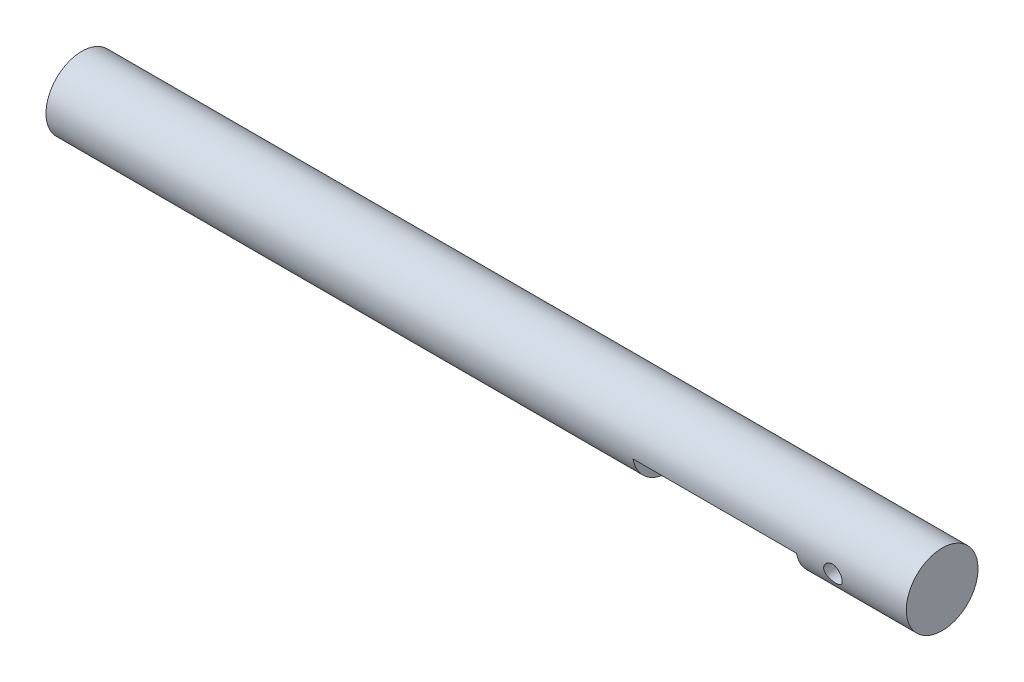
ISO-10303-21;
HEADER;
FILE_DESCRIPTION(('STEP AP214'),'2;1');
FILE_NAME('part.step','',(''),(''),'','','');
FILE_SCHEMA(('AUTOMOTIVE_DESIGN { 1 0 10303 214 1 1 1 1 }'));
ENDSEC;
DATA;
#1=APPLICATION_CONTEXT('core data for automotive mechanical design processes');
#2=APPLICATION_PROTOCOL_DEFINITION('international standard','automotive_design',2000,#1);
#3=PRODUCT_CONTEXT('',#1,'mechanical');
#4=PRODUCT('Part','Part','',(#3));
#5=PRODUCT_RELATED_PRODUCT_CATEGORY('part','',(#4));
#6=PRODUCT_DEFINITION_FORMATION('','',#4);
#7=PRODUCT_DEFINITION_CONTEXT('part definition',#1,'design');
#8=PRODUCT_DEFINITION('design','',#6,#7);
#9=PRODUCT_DEFINITION_SHAPE('','',#8);
#10=(LENGTH_UNIT() NAMED_UNIT(*) SI_UNIT(.MILLI.,.METRE.));
#11=(NAMED_UNIT(*) PLANE_ANGLE_UNIT() SI_UNIT($,.RADIAN.));
#12=(NAMED_UNIT(*) SI_UNIT($,.STERADIAN.) SOLID_ANGLE_UNIT());
#13=UNCERTAINTY_MEASURE_WITH_UNIT(LENGTH_MEASURE(1.E-05),#10,'distance_accuracy_value','');
#14=(GEOMETRIC_REPRESENTATION_CONTEXT(3) GLOBAL_UNCERTAINTY_ASSIGNED_CONTEXT((#13)) GLOBAL_UNIT_ASSIGNED_CONTEXT((#10,
#11,#12)) REPRESENTATION_CONTEXT('',''));
#15=CARTESIAN_POINT('',(0.,0.,0.));
#16=DIRECTION('',(0.,0.,1.));
#17=DIRECTION('',(1.,0.,0.));
#18=AXIS2_PLACEMENT_3D('',#15,#16,#17);
#19=CARTESIAN_POINT('',(33.5,6.25,0.));
#20=DIRECTION('',(-1.,0.,0.));
#21=DIRECTION('',(0.,0.,1.));
#22=AXIS2_PLACEMENT_3D('',#19,#20,#21);
#23=CYLINDRICAL_SURFACE('',#22,6.25);
#24=CARTESIAN_POINT('',(-116.5,6.25,0.));
#25=DIRECTION('',(-1.,0.,0.));
#26=DIRECTION('',(0.,-1.,0.));
#27=AXIS2_PLACEMENT_3D('',#24,#25,#26);
#28=CIRCLE('',#27,6.25);
#29=CARTESIAN_POINT('',(-116.5,0.,0.));
#30=VERTEX_POINT('',#29);
#31=EDGE_CURVE('E75',#30,#30,#28,.T.);
#32=ORIENTED_EDGE('',*,*,#31,.F.);
#33=EDGE_LOOP('',(#32));
#34=FACE_BOUND('',#33,.T.);
#35=CARTESIAN_POINT('',(33.5,6.25,0.));
#36=DIRECTION('',(-1.,0.,0.));
#37=DIRECTION('',(0.,-1.,0.));
#38=AXIS2_PLACEMENT_3D('',#35,#36,#37);
#39=CIRCLE('',#38,6.25);
#40=CARTESIAN_POINT('',(33.5,0.,0.));
#41=VERTEX_POINT('',#40);
#42=EDGE_CURVE('E66',#41,#41,#39,.T.);
#43=ORIENTED_EDGE('',*,*,#42,.T.);
#44=EDGE_LOOP('',(#43));
#45=FACE_BOUND('',#44,.T.);
#46=CARTESIAN_POINT('',(14.25,6.25,0.));
#47=DIRECTION('',(-1.,0.,0.));
#48=DIRECTION('',(0.,-1.,0.));
#49=AXIS2_PLACEMENT_3D('',#46,#47,#48);
#50=CIRCLE('',#49,6.25);
#51=CARTESIAN_POINT('',(14.25,5.14999999999997,-6.15243854093642));
#52=VERTEX_POINT('',#51);
#53=CARTESIAN_POINT('',(14.25,5.14999999999994,6.15243854093642));
#54=VERTEX_POINT('',#53);
#55=EDGE_CURVE('E49',#52,#54,#50,.T.);
#56=ORIENTED_EDGE('',*,*,#55,.F.);
#57=DIRECTION('',(-1.,0.,0.));
#58=VECTOR('',#57,1.);
#59=CARTESIAN_POINT('',(33.5,5.14999999999994,-6.15243854093642));
#60=LINE('',#59,#58);
#61=CARTESIAN_POINT('',(-14.25,5.15,-6.15243854093642));
#62=VERTEX_POINT('',#61);
#63=EDGE_CURVE('E11',#62,#52,#60,.F.);
#64=ORIENTED_EDGE('',*,*,#63,.F.);
#65=CARTESIAN_POINT('',(-14.25,6.25,0.));
#66=DIRECTION('',(-1.,0.,0.));
#67=DIRECTION('',(0.,0.,1.));
#68=AXIS2_PLACEMENT_3D('',#65,#66,#67);
#69=CIRCLE('',#68,6.25);
#70=CARTESIAN_POINT('',(-14.25,5.15,6.15243854093642));
#71=VERTEX_POINT('',#70);
#72=EDGE_CURVE('E56',#62,#71,#69,.T.);
#73=ORIENTED_EDGE('',*,*,#72,.T.);
#74=DIRECTION('',(-1.,0.,0.));
#75=VECTOR('',#74,1.);
#76=CARTESIAN_POINT('',(33.5,5.14999999999994,6.15243854093642));
#77=LINE('',#76,#75);
#78=EDGE_CURVE('E43',#54,#71,#77,.T.);
#79=ORIENTED_EDGE('',*,*,#78,.F.);
#80=EDGE_LOOP('',(#56,#64,#73,#79));
#81=FACE_BOUND('',#80,.T.);
#82=CARTESIAN_POINT('',(19.0125,5.15,6.15243854093643));
#83=CARTESIAN_POINT('',(19.0125034400561,5.05894949307662,6.13615705257174));
#84=CARTESIAN_POINT('',(19.0203601154514,4.9682213588185,6.11783029645399));
#85=CARTESIAN_POINT('',(19.0511888044404,4.79009711635156,6.07779115017929));
#86=CARTESIAN_POINT('',(19.0741766136601,4.70270459121124,6.05607524012436));
#87=CARTESIAN_POINT('',(19.1342386068315,4.53378915505121,6.0103876617501));
#88=CARTESIAN_POINT('',(19.1712801490714,4.45225315944522,5.98642131671098));
#89=CARTESIAN_POINT('',(19.2583276946763,4.2967625399177,5.93750910818044));
#90=CARTESIAN_POINT('',(19.3083340085916,4.22280809765933,5.91256322123781));
#91=CARTESIAN_POINT('',(19.4220288356238,4.08181562838189,5.86236032008227));
#92=CARTESIAN_POINT('',(19.4861260121833,4.01509973526759,5.83712173737863));
#93=CARTESIAN_POINT('',(19.6254676733933,3.89341870182155,5.78906839779039));
#94=CARTESIAN_POINT('',(19.7007129875245,3.83845443661772,5.76625382148188));
#95=CARTESIAN_POINT('',(19.8594414638567,3.7428080921375,5.72530925588944));
#96=CARTESIAN_POINT('',(19.9427920156136,3.70193372441335,5.70711716671715));
#97=CARTESIAN_POINT('',(20.116305029815,3.63513437033712,5.67682477613882));
#98=CARTESIAN_POINT('',(20.2064619394486,3.60919734363187,5.66471956935823));
#99=CARTESIAN_POINT('',(20.38280527059,3.57508562405573,5.64868641974786));
#100=CARTESIAN_POINT('',(20.4686823865482,3.56559394262753,5.64415335111095));
#101=CARTESIAN_POINT('',(20.6409159077228,3.56069332040718,5.64182075028513));
#102=CARTESIAN_POINT('',(20.7272721291581,3.56527930826678,5.64401879327574));
#103=CARTESIAN_POINT('',(20.8924984016978,3.58758806425763,5.65457291716716));
#104=CARTESIAN_POINT('',(20.9715051391808,3.60449861803912,5.66254808487443));
#105=CARTESIAN_POINT('',(21.125434540663,3.64982835099032,5.68350472928734));
#106=CARTESIAN_POINT('',(21.2003565623908,3.67824933414588,5.69648699072054));
#107=CARTESIAN_POINT('',(21.3470019920881,3.74681447080504,5.72695486548573));
#108=CARTESIAN_POINT('',(21.4185160017484,3.78734060206403,5.74458458570154));
#109=CARTESIAN_POINT('',(21.553936410097,3.87845411887118,5.78279409801211));
#110=CARTESIAN_POINT('',(21.6178399467961,3.9290452704841,5.80337499355138));
#111=CARTESIAN_POINT('',(21.7421146847953,4.04388125626948,5.8480468529554));
#112=CARTESIAN_POINT('',(21.8016870706405,4.10893360392103,5.87228737234194));
#113=CARTESIAN_POINT('',(21.9092414595319,4.24790842013142,5.92111086505682));
#114=CARTESIAN_POINT('',(21.9572194043146,4.32183398096361,5.94569395511597));
#115=CARTESIAN_POINT('',(22.0425598966332,4.48087489658101,5.99499507301222));
#116=CARTESIAN_POINT('',(22.0792525177699,4.56636952801247,6.01965546731216));
#117=CARTESIAN_POINT('',(22.1372856824014,4.74311429916242,6.06631187311527));
#118=CARTESIAN_POINT('',(22.1586284056375,4.83436361969164,6.08830826254778));
#119=CARTESIAN_POINT('',(22.1846452793123,5.01790856419232,6.12805544362383));
#120=CARTESIAN_POINT('',(22.1896879288205,5.11013304647882,6.14589150739708));
#121=CARTESIAN_POINT('',(22.1835785232579,5.29477181348628,6.17728082605186));
#122=CARTESIAN_POINT('',(22.1724318806882,5.38718602446242,6.19083551046544));
#123=CARTESIAN_POINT('',(22.1349537335178,5.56458159040548,6.21291377369791));
#124=CARTESIAN_POINT('',(22.1094117626261,5.64970328166666,6.2216555673564));
#125=CARTESIAN_POINT('',(22.0443465663328,5.8147436835075,6.23537577702151));
#126=CARTESIAN_POINT('',(22.0048247862676,5.89466293094343,6.24035458190698));
#127=CARTESIAN_POINT('',(21.913823965725,6.04533005356452,6.2470948764738));
#128=CARTESIAN_POINT('',(21.862599261575,6.11622911573901,6.24891858322368));
#129=CARTESIAN_POINT('',(21.7492024727391,6.24867703090497,6.25035138169719));
#130=CARTESIAN_POINT('',(21.6870297405127,6.31022533042765,6.24996034238308));
#131=CARTESIAN_POINT('',(21.5526620772477,6.42293790613247,6.24786489018451));
#132=CARTESIAN_POINT('',(21.4803582249902,6.47397202601017,6.24614513812272));
#133=CARTESIAN_POINT('',(21.3282938894633,6.56333748786835,6.24230146237706));
#134=CARTESIAN_POINT('',(21.2485329895371,6.60166811950682,6.24017751610226));
#135=CARTESIAN_POINT('',(21.0827867460405,6.66493628296196,6.23629305803389));
#136=CARTESIAN_POINT('',(20.9967398389418,6.68971299452197,6.23453705662098));
#137=CARTESIAN_POINT('',(20.8216950815527,6.72447441941379,6.23198857753266));
#138=CARTESIAN_POINT('',(20.7326972761519,6.73445935765547,6.23119608520707));
#139=CARTESIAN_POINT('',(20.5543972841055,6.73934585853901,6.2308143224154));
#140=CARTESIAN_POINT('',(20.4650956176995,6.73426627991663,6.23122354755544));
#141=CARTESIAN_POINT('',(20.2886185424207,6.70921172209549,6.23311956685318));
#142=CARTESIAN_POINT('',(20.2014431672328,6.68923650707734,6.23460637807061));
#143=CARTESIAN_POINT('',(20.0317452652288,6.63498246583709,6.23819054535774));
#144=CARTESIAN_POINT('',(19.9492195548511,6.60071356478367,6.24028747747019));
#145=CARTESIAN_POINT('',(19.7910677824419,6.51883674374733,6.24434937845433));
#146=CARTESIAN_POINT('',(19.7154418768612,6.47122852139904,6.24631434433345));
#147=CARTESIAN_POINT('',(19.5730329931037,6.36386452001311,6.24919335357978));
#148=CARTESIAN_POINT('',(19.5062733604404,6.30407768190603,6.25010466934269));
#149=CARTESIAN_POINT('',(19.383739997277,6.17412954246134,6.24987633368118));
#150=CARTESIAN_POINT('',(19.3279667974562,6.10396774026668,6.24873658321075));
#151=CARTESIAN_POINT('',(19.229457740369,5.95598125606282,6.24351523976515));
#152=CARTESIAN_POINT('',(19.1866152373632,5.87822667367627,6.23945870000341));
#153=CARTESIAN_POINT('',(19.1145625865425,5.71693934167787,6.22774930761431));
#154=CARTESIAN_POINT('',(19.0853415755914,5.63341125769234,6.22009933056189));
#155=CARTESIAN_POINT('',(19.0463589532224,5.48303145748763,6.20311116946818));
#156=CARTESIAN_POINT('',(19.0336482148878,5.41683439961674,6.19458296778898));
#157=CARTESIAN_POINT('',(19.0167173896474,5.2837004614607,6.17521594787551));
#158=CARTESIAN_POINT('',(19.0124974775493,5.21676356597241,6.1643770820747));
#159=CARTESIAN_POINT('',(19.0125,5.15,6.15243854093643));
#160=B_SPLINE_CURVE_WITH_KNOTS('',3,(#82,#83,#84,#85,#86,#87,#88,#89,#90,#91,#92,#93,#94,#95,
#96,#97,#98,#99,#100,#101,#102,#103,#104,#105,#106,#107,#108,#109,#110,#111,#112,#113,#114,#115,
#116,#117,#118,#119,#120,#121,#122,#123,#124,#125,#126,#127,#128,#129,#130,#131,#132,#133,#134,
#135,#136,#137,#138,#139,#140,#141,#142,#143,#144,#145,#146,#147,#148,#149,#150,#151,#152,#153,
#154,#155,#156,#157,#158,#159),.UNSPECIFIED.,.T.,.F.,(4,2,2,2,2,2,2,2,2,2,2,2,2,2,2,2,2,2,2,2,2,
2,2,2,2,2,2,2,2,2,2,2,2,2,2,2,2,2,4),(0.,0.277225349261248,0.554740558331614,0.831615107707004,
1.10849628978152,1.39482581379738,1.6811766529666,1.96344860324396,2.24549270654046,
2.50367734302081,2.76176898182502,3.00423376216557,3.24673655780443,3.49788876975718,
3.74913513357871,4.02237365718313,4.29570768112714,4.58304779001523,4.87034708750057,
5.15110419029711,5.43176745030251,5.69835581242251,5.96491662071158,6.22615837463258,
6.48741558535419,6.75173476095854,7.0160687140276,7.28347453975165,7.55087629951132,
7.81794344982796,8.08501482829218,8.35190106715985,8.61879335608711,8.88637501809365,
9.15396960197107,9.41929277618297,9.68440399169708,9.8876776744081,10.0909555420448),.UNSPECIFIED.);
#161=CARTESIAN_POINT('',(19.0125,5.15,6.15243854093643));
#162=VERTEX_POINT('',#161);
#163=EDGE_CURVE('E203',#162,#162,#160,.T.);
#164=ORIENTED_EDGE('',*,*,#163,.F.);
#165=EDGE_LOOP('',(#164));
#166=FACE_BOUND('',#165,.T.);
#167=ADVANCED_FACE('F36',(#34,#45,#81,#166),#23,.T.);
#168=CARTESIAN_POINT('',(33.5,6.25,0.));
#169=DIRECTION('',(-1.,0.,0.));
#170=DIRECTION('',(0.,-1.,0.));
#171=AXIS2_PLACEMENT_3D('',#168,#169,#170);
#172=PLANE('',#171);
#173=ORIENTED_EDGE('',*,*,#42,.F.);
#174=EDGE_LOOP('',(#173));
#175=FACE_BOUND('',#174,.T.);
#176=ADVANCED_FACE('F101',(#175),#172,.F.);
#177=CARTESIAN_POINT('',(-116.5,6.25,0.));
#178=DIRECTION('',(-1.,0.,0.));
#179=DIRECTION('',(0.,-1.,0.));
#180=AXIS2_PLACEMENT_3D('',#177,#178,#179);
#181=PLANE('',#180);
#182=ORIENTED_EDGE('',*,*,#31,.T.);
#183=EDGE_LOOP('',(#182));
#184=FACE_BOUND('',#183,.T.);
#185=ADVANCED_FACE('F98',(#184),#181,.T.);
#186=CARTESIAN_POINT('',(14.25,5.14999999999997,-6.25));
#187=DIRECTION('',(1.,0.,0.));
#188=DIRECTION('',(0.,1.,0.));
#189=AXIS2_PLACEMENT_3D('',#186,#187,#188);
#190=PLANE('',#189);
#191=DIRECTION('',(0.,0.,1.));
#192=VECTOR('',#191,1.);
#193=CARTESIAN_POINT('',(14.25,5.14999999999997,-6.25));
#194=LINE('',#193,#192);
#195=EDGE_CURVE('E70',#52,#54,#194,.T.);
#196=ORIENTED_EDGE('',*,*,#195,.F.);
#197=ORIENTED_EDGE('',*,*,#55,.T.);
#198=EDGE_LOOP('',(#196,#197));
#199=FACE_BOUND('',#198,.T.);
#200=ADVANCED_FACE('F72',(#199),#190,.F.);
#201=CARTESIAN_POINT('',(-14.25,5.15,-6.25));
#202=DIRECTION('',(-1.,0.,0.));
#203=DIRECTION('',(0.,-1.,0.));
#204=AXIS2_PLACEMENT_3D('',#201,#202,#203);
#205=PLANE('',#204);
#206=DIRECTION('',(0.,0.,-1.));
#207=VECTOR('',#206,1.);
#208=CARTESIAN_POINT('',(-14.25,5.15,-6.25));
#209=LINE('',#208,#207);
#210=EDGE_CURVE('E71',#71,#62,#209,.T.);
#211=ORIENTED_EDGE('',*,*,#210,.F.);
#212=ORIENTED_EDGE('',*,*,#72,.F.);
#213=EDGE_LOOP('',(#211,#212));
#214=FACE_BOUND('',#213,.T.);
#215=ADVANCED_FACE('F88',(#214),#205,.F.);
#216=CARTESIAN_POINT('',(0.,5.14999999999998,0.));
#217=DIRECTION('',(0.,1.,0.));
#218=DIRECTION('',(-1.,0.,0.));
#219=AXIS2_PLACEMENT_3D('',#216,#217,#218);
#220=PLANE('',#219);
#221=CARTESIAN_POINT('',(-7.49999999999999,5.14999999999999,0.));
#222=DIRECTION('',(0.,-1.,0.));
#223=DIRECTION('',(1.,0.,0.));
#224=AXIS2_PLACEMENT_3D('',#221,#222,#223);
#225=CIRCLE('',#224,1.25);
#226=CARTESIAN_POINT('',(-6.25,5.14999999999999,0.));
#227=VERTEX_POINT('',#226);
#228=EDGE_CURVE('E78',#227,#227,#225,.T.);
#229=ORIENTED_EDGE('',*,*,#228,.F.);
#230=EDGE_LOOP('',(#229));
#231=FACE_BOUND('',#230,.T.);
#232=CARTESIAN_POINT('',(7.50000000000001,5.14999999999997,0.));
#233=DIRECTION('',(0.,-1.,0.));
#234=DIRECTION('',(1.,0.,0.));
#235=AXIS2_PLACEMENT_3D('',#232,#233,#234);
#236=CIRCLE('',#235,1.25);
#237=CARTESIAN_POINT('',(8.75,5.14999999999997,0.));
#238=VERTEX_POINT('',#237);
#239=EDGE_CURVE('E81',#238,#238,#236,.T.);
#240=ORIENTED_EDGE('',*,*,#239,.F.);
#241=EDGE_LOOP('',(#240));
#242=FACE_BOUND('',#241,.T.);
#243=ORIENTED_EDGE('',*,*,#63,.T.);
#244=ORIENTED_EDGE('',*,*,#195,.T.);
#245=ORIENTED_EDGE('',*,*,#78,.T.);
#246=ORIENTED_EDGE('',*,*,#210,.T.);
#247=EDGE_LOOP('',(#243,#244,#245,#246));
#248=FACE_BOUND('',#247,.T.);
#249=ADVANCED_FACE('F69',(#231,#242,#248),#220,.F.);
#250=CARTESIAN_POINT('',(7.50000000000001,8.32499999999997,0.));
#251=DIRECTION('',(0.,-1.,0.));
#252=DIRECTION('',(1.,0.,0.));
#253=AXIS2_PLACEMENT_3D('',#250,#251,#252);
#254=CYLINDRICAL_SURFACE('',#253,1.25);
#255=CARTESIAN_POINT('',(7.50000000000001,8.32499999999997,0.));
#256=DIRECTION('',(0.,-1.,0.));
#257=DIRECTION('',(1.,0.,0.));
#258=AXIS2_PLACEMENT_3D('',#255,#256,#257);
#259=CIRCLE('',#258,1.25);
#260=CARTESIAN_POINT('',(8.75000000000001,8.32499999999997,0.));
#261=VERTEX_POINT('',#260);
#262=EDGE_CURVE('E212',#261,#261,#259,.T.);
#263=ORIENTED_EDGE('',*,*,#262,.F.);
#264=EDGE_LOOP('',(#263));
#265=FACE_BOUND('',#264,.T.);
#266=ORIENTED_EDGE('',*,*,#239,.T.);
#267=EDGE_LOOP('',(#266));
#268=FACE_BOUND('',#267,.T.);
#269=ADVANCED_FACE('F95',(#265,#268),#254,.F.);
#270=CARTESIAN_POINT('',(7.50000000000001,8.32499999999997,0.));
#271=DIRECTION('',(0.,-1.,0.));
#272=DIRECTION('',(1.,0.,0.));
#273=AXIS2_PLACEMENT_3D('',#270,#271,#272);
#274=PLANE('',#273);
#275=ORIENTED_EDGE('',*,*,#262,.T.);
#276=EDGE_LOOP('',(#275));
#277=FACE_BOUND('',#276,.T.);
#278=ADVANCED_FACE('F140',(#277),#274,.T.);
#279=CARTESIAN_POINT('',(-7.49999999999999,8.32499999999999,0.));
#280=DIRECTION('',(0.,-1.,0.));
#281=DIRECTION('',(1.,0.,0.));
#282=AXIS2_PLACEMENT_3D('',#279,#280,#281);
#283=CYLINDRICAL_SURFACE('',#282,1.25);
#284=CARTESIAN_POINT('',(-7.49999999999999,8.32499999999999,0.));
#285=DIRECTION('',(0.,-1.,0.));
#286=DIRECTION('',(1.,0.,0.));
#287=AXIS2_PLACEMENT_3D('',#284,#285,#286);
#288=CIRCLE('',#287,1.25);
#289=CARTESIAN_POINT('',(-6.24999999999999,8.32499999999999,0.));
#290=VERTEX_POINT('',#289);
#291=EDGE_CURVE('E73',#290,#290,#288,.T.);
#292=ORIENTED_EDGE('',*,*,#291,.F.);
#293=EDGE_LOOP('',(#292));
#294=FACE_BOUND('',#293,.T.);
#295=ORIENTED_EDGE('',*,*,#228,.T.);
#296=EDGE_LOOP('',(#295));
#297=FACE_BOUND('',#296,.T.);
#298=ADVANCED_FACE('F150',(#294,#297),#283,.F.);
#299=CARTESIAN_POINT('',(-7.49999999999999,8.32499999999999,0.));
#300=DIRECTION('',(0.,-1.,0.));
#301=DIRECTION('',(1.,0.,0.));
#302=AXIS2_PLACEMENT_3D('',#299,#300,#301);
#303=PLANE('',#302);
#304=ORIENTED_EDGE('',*,*,#291,.T.);
#305=EDGE_LOOP('',(#304));
#306=FACE_BOUND('',#305,.T.);
#307=ADVANCED_FACE('F160',(#306),#303,.T.);
#308=CARTESIAN_POINT('',(20.6,5.15,6.251));
#309=DIRECTION('',(0.,0.,-1.));
#310=DIRECTION('',(-1.,0.,0.));
#311=AXIS2_PLACEMENT_3D('',#308,#309,#310);
#312=CYLINDRICAL_SURFACE('',#311,1.5875);
#313=CARTESIAN_POINT('',(20.6,5.15,0.));
#314=DIRECTION('',(0.,0.,1.));
#315=DIRECTION('',(1.,0.,0.));
#316=AXIS2_PLACEMENT_3D('',#313,#314,#315);
#317=CIRCLE('',#316,1.5875);
#318=CARTESIAN_POINT('',(22.1875,5.15,0.));
#319=VERTEX_POINT('',#318);
#320=EDGE_CURVE('E209',#319,#319,#317,.T.);
#321=ORIENTED_EDGE('',*,*,#320,.F.);
#322=EDGE_LOOP('',(#321));
#323=FACE_BOUND('',#322,.T.);
#324=ORIENTED_EDGE('',*,*,#163,.T.);
#325=EDGE_LOOP('',(#324));
#326=FACE_BOUND('',#325,.T.);
#327=ADVANCED_FACE('F169',(#323,#326),#312,.F.);
#328=CARTESIAN_POINT('',(20.6,5.15,0.));
#329=DIRECTION('',(0.,0.,1.));
#330=DIRECTION('',(1.,0.,0.));
#331=AXIS2_PLACEMENT_3D('',#328,#329,#330);
#332=PLANE('',#331);
#333=ORIENTED_EDGE('',*,*,#320,.T.);
#334=EDGE_LOOP('',(#333));
#335=FACE_BOUND('',#334,.T.);
#336=ADVANCED_FACE('F184',(#335),#332,.T.);
#337=CLOSED_SHELL('',(#167,#176,#185,#200,#215,#249,#269,#278,#298,#307,#327,#336));
#338=MANIFOLD_SOLID_BREP('B2',#337);
#339=ADVANCED_BREP_SHAPE_REPRESENTATION('',(#18,#338),#14);
#340=SHAPE_DEFINITION_REPRESENTATION(#9,#339);
ENDSEC;
END-ISO-10303-21;
